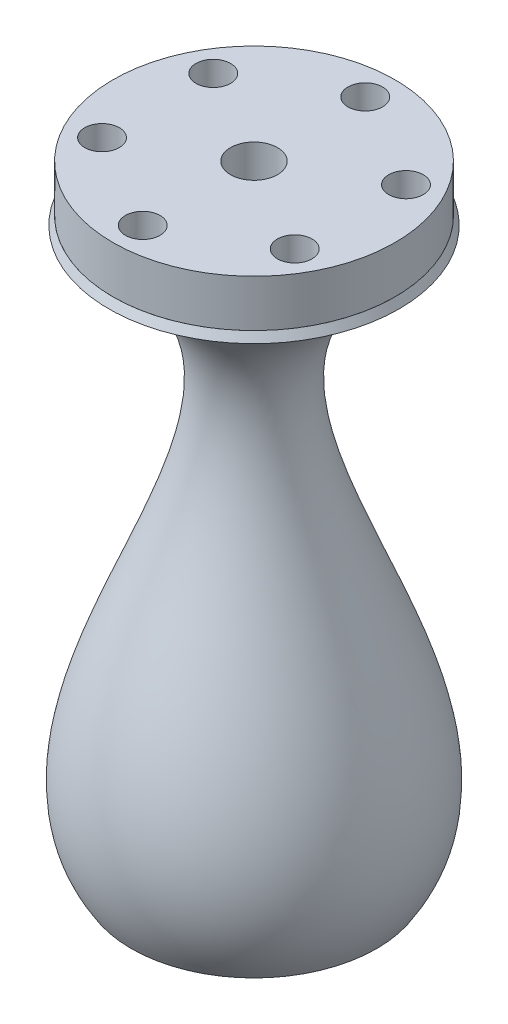
ISO-10303-21;
HEADER;
FILE_DESCRIPTION(('STEP AP214'),'2;1');
FILE_NAME('part.step','',(''),(''),'','','');
FILE_SCHEMA(('AUTOMOTIVE_DESIGN { 1 0 10303 214 1 1 1 1 }'));
ENDSEC;
DATA;
#1=APPLICATION_CONTEXT('core data for automotive mechanical design processes');
#2=APPLICATION_PROTOCOL_DEFINITION('international standard','automotive_design',2000,#1);
#3=PRODUCT_CONTEXT('',#1,'mechanical');
#4=PRODUCT('Part','Part','',(#3));
#5=PRODUCT_RELATED_PRODUCT_CATEGORY('part','',(#4));
#6=PRODUCT_DEFINITION_FORMATION('','',#4);
#7=PRODUCT_DEFINITION_CONTEXT('part definition',#1,'design');
#8=PRODUCT_DEFINITION('design','',#6,#7);
#9=PRODUCT_DEFINITION_SHAPE('','',#8);
#10=(LENGTH_UNIT() NAMED_UNIT(*) SI_UNIT(.MILLI.,.METRE.));
#11=(NAMED_UNIT(*) PLANE_ANGLE_UNIT() SI_UNIT($,.RADIAN.));
#12=(NAMED_UNIT(*) SI_UNIT($,.STERADIAN.) SOLID_ANGLE_UNIT());
#13=UNCERTAINTY_MEASURE_WITH_UNIT(LENGTH_MEASURE(1.E-05),#10,'distance_accuracy_value','');
#14=(GEOMETRIC_REPRESENTATION_CONTEXT(3) GLOBAL_UNCERTAINTY_ASSIGNED_CONTEXT((#13)) GLOBAL_UNIT_ASSIGNED_CONTEXT((#10,
#11,#12)) REPRESENTATION_CONTEXT('',''));
#15=CARTESIAN_POINT('',(0.,0.,0.));
#16=DIRECTION('',(0.,0.,1.));
#17=DIRECTION('',(1.,0.,0.));
#18=AXIS2_PLACEMENT_3D('',#15,#16,#17);
#19=CARTESIAN_POINT('',(-31.75,-154.94,0.));
#20=DIRECTION('',(0.,-1.,0.));
#21=DIRECTION('',(1.,0.,0.));
#22=AXIS2_PLACEMENT_3D('',#19,#20,#21);
#23=PLANE('',#22);
#24=CARTESIAN_POINT('',(0.,-154.94,0.));
#25=DIRECTION('',(0.,1.,0.));
#26=DIRECTION('',(-1.,0.,0.));
#27=AXIS2_PLACEMENT_3D('',#24,#25,#26);
#28=CIRCLE('',#27,33.1702305805805);
#29=CARTESIAN_POINT('',(-33.1702305805805,-154.94,0.));
#30=VERTEX_POINT('',#29);
#31=EDGE_CURVE('E59',#30,#30,#28,.T.);
#32=ORIENTED_EDGE('',*,*,#31,.F.);
#33=EDGE_LOOP('',(#32));
#34=FACE_BOUND('',#33,.T.);
#35=ADVANCED_FACE('F45',(#34),#23,.T.);
#36=CARTESIAN_POINT('',(-31.75,-152.4,0.));
#37=DIRECTION('',(0.,-1.,0.));
#38=DIRECTION('',(1.,0.,0.));
#39=AXIS2_PLACEMENT_3D('',#36,#37,#38);
#40=PLANE('',#39);
#41=CARTESIAN_POINT('',(0.,-152.4,0.));
#42=DIRECTION('',(0.,1.,0.));
#43=DIRECTION('',(-1.,0.,0.));
#44=AXIS2_PLACEMENT_3D('',#41,#42,#43);
#45=CIRCLE('',#44,31.75);
#46=CARTESIAN_POINT('',(-31.75,-152.4,0.));
#47=VERTEX_POINT('',#46);
#48=EDGE_CURVE('E11',#47,#47,#45,.T.);
#49=ORIENTED_EDGE('',*,*,#48,.T.);
#50=EDGE_LOOP('',(#49));
#51=FACE_BOUND('',#50,.T.);
#52=ADVANCED_FACE('F85',(#51),#40,.F.);
#53=CARTESIAN_POINT('',(-38.1,0.,0.));
#54=CARTESIAN_POINT('',(32.6762397187131,-33.7855898671001,0.));
#55=CARTESIAN_POINT('',(-59.5523791944092,-107.166993136059,0.));
#56=CARTESIAN_POINT('',(-31.75,-152.4,0.));
#57=B_SPLINE_CURVE_WITH_KNOTS('',3,(#53,#54,#55,#56),.UNSPECIFIED.,.F.,.F.,(4,4),(0.,1.),.UNSPECIFIED.);
#58=CARTESIAN_POINT('',(0.,0.,0.));
#59=DIRECTION('',(0.,1.,0.));
#60=AXIS1_PLACEMENT('',#58,#59);
#61=SURFACE_OF_REVOLUTION('',#57,#60);
#62=ORIENTED_EDGE('',*,*,#48,.F.);
#63=EDGE_LOOP('',(#62));
#64=FACE_BOUND('',#63,.T.);
#65=CARTESIAN_POINT('',(0.,0.,0.));
#66=DIRECTION('',(0.,1.,0.));
#67=DIRECTION('',(-1.,0.,0.));
#68=AXIS2_PLACEMENT_3D('',#65,#66,#67);
#69=CIRCLE('',#68,38.1);
#70=CARTESIAN_POINT('',(-38.1,0.,0.));
#71=VERTEX_POINT('',#70);
#72=EDGE_CURVE('E51',#71,#71,#69,.T.);
#73=ORIENTED_EDGE('',*,*,#72,.T.);
#74=EDGE_LOOP('',(#73));
#75=FACE_BOUND('',#74,.T.);
#76=ADVANCED_FACE('F82',(#64,#75),#61,.T.);
#77=CARTESIAN_POINT('',(0.,-2.29222602947274,0.));
#78=DIRECTION('',(0.,-1.,0.));
#79=DIRECTION('',(1.,0.,0.));
#80=AXIS2_PLACEMENT_3D('',#77,#78,#79);
#81=CONICAL_SURFACE('',#80,39.1942119674942,0.445370328452159);
#82=ORIENTED_EDGE('',*,*,#72,.F.);
#83=EDGE_LOOP('',(#82));
#84=FACE_BOUND('',#83,.T.);
#85=CARTESIAN_POINT('',(0.,-2.29222602947274,0.));
#86=DIRECTION('',(0.,1.,0.));
#87=DIRECTION('',(-1.,0.,0.));
#88=AXIS2_PLACEMENT_3D('',#85,#86,#87);
#89=CIRCLE('',#88,39.1942119674942);
#90=CARTESIAN_POINT('',(-39.1942119674942,-2.29222602947274,0.));
#91=VERTEX_POINT('',#90);
#92=EDGE_CURVE('E55',#91,#91,#89,.T.);
#93=ORIENTED_EDGE('',*,*,#92,.T.);
#94=EDGE_LOOP('',(#93));
#95=FACE_BOUND('',#94,.T.);
#96=ADVANCED_FACE('F78',(#84,#95),#81,.T.);
#97=CARTESIAN_POINT('',(-39.1942119674942,-2.29222602947274,0.));
#98=CARTESIAN_POINT('',(-34.8614389105815,-4.36050903051737,0.));
#99=CARTESIAN_POINT('',(-31.1927398060546,-6.56541806497867,0.));
#100=CARTESIAN_POINT('',(-25.0245259468001,-11.1917654300556,0.));
#101=CARTESIAN_POINT('',(-22.5248031803444,-13.6117942958894,0.));
#102=CARTESIAN_POINT('',(-18.5061974273643,-18.6340152584461,0.));
#103=CARTESIAN_POINT('',(-16.985107261721,-21.2364897960595,0.));
#104=CARTESIAN_POINT('',(-14.7412279242141,-26.6431128882137,0.));
#105=CARTESIAN_POINT('',(-14.0184683618747,-29.4497739423554,0.));
#106=CARTESIAN_POINT('',(-13.2446976955873,-35.2881632791064,0.));
#107=CARTESIAN_POINT('',(-13.1953262185129,-38.3198644747277,0.));
#108=CARTESIAN_POINT('',(-13.662043390385,-44.5854767210561,0.));
#109=CARTESIAN_POINT('',(-14.1784352466751,-47.818456499126,0.));
#110=CARTESIAN_POINT('',(-16.3935618163439,-57.7522203017617,0.));
#111=CARTESIAN_POINT('',(-18.7602520873641,-64.6843609559365,0.));
#112=CARTESIAN_POINT('',(-24.1796149998284,-78.8223622197904,0.));
#113=CARTESIAN_POINT('',(-27.2299749549672,-86.0283321852692,0.));
#114=CARTESIAN_POINT('',(-32.8773088829367,-100.437664235248,0.));
#115=CARTESIAN_POINT('',(-35.4759335781833,-107.640919919764,0.));
#116=CARTESIAN_POINT('',(-38.1609616535489,-118.286689066183,0.));
#117=CARTESIAN_POINT('',(-38.8534735497201,-121.80951657246,0.));
#118=CARTESIAN_POINT('',(-39.6758277379926,-128.780297418311,0.));
#119=CARTESIAN_POINT('',(-39.805605332258,-132.229002500746,0.));
#120=CARTESIAN_POINT('',(-39.331567575255,-139.015933352786,0.));
#121=CARTESIAN_POINT('',(-38.7265059441794,-142.354675982864,0.));
#122=CARTESIAN_POINT('',(-37.1427109304725,-147.225371889751,0.));
#123=CARTESIAN_POINT('',(-36.5022686312662,-148.825657092171,0.));
#124=CARTESIAN_POINT('',(-35.3602879587102,-151.18233174534,0.));
#125=CARTESIAN_POINT('',(-34.9494356916948,-151.960593782365,0.));
#126=CARTESIAN_POINT('',(-34.3970178777034,-152.923416220121,0.));
#127=CARTESIAN_POINT('',(-34.2283792891868,-153.211512947473,0.));
#128=CARTESIAN_POINT('',(-34.0409217152594,-153.522373424794,0.));
#129=CARTESIAN_POINT('',(-33.9680564151279,-153.641733741039,0.));
#130=CARTESIAN_POINT('',(-33.9388489468107,-153.689461715374,0.));
#131=CARTESIAN_POINT('',(-33.9235339112807,-153.714415150231,0.));
#132=CARTESIAN_POINT('',(-33.882444638697,-153.781265232946,0.));
#133=CARTESIAN_POINT('',(-33.6359090031952,-154.182365729234,0.));
#134=CARTESIAN_POINT('',(-33.3893733676933,-154.583466225522,0.));
#135=CARTESIAN_POINT('',(-33.1702305805804,-154.94,0.));
#136=B_SPLINE_CURVE_WITH_KNOTS('',3,(#97,#98,#99,#100,#101,#102,#103,#104,#105,#106,#107,#108,
#109,#110,#111,#112,#113,#114,#115,#116,#117,#118,#119,#120,#121,#122,#123,#124,#125,#126,#127,
#128,#129,#130,#131,#132,#133,#134,#135),.UNSPECIFIED.,.F.,.F.,(4,2,2,2,2,2,2,2,2,2,2,2,2,2,2,1,
1,2,2,1,4),(0.,0.0625,0.125,0.1875,0.25,0.3125,0.375,0.5,0.624999999999999,0.749999999999999,
0.812499999999999,0.874999999999999,0.937499999999999,0.968749999999998,0.984374999999998,
0.988281249999998,0.990234374999998,0.990722656249998,0.991210937499998,0.992187499999998,1.),.UNSPECIFIED.);
#137=CARTESIAN_POINT('',(0.,0.,0.));
#138=DIRECTION('',(0.,1.,0.));
#139=AXIS1_PLACEMENT('',#137,#138);
#140=SURFACE_OF_REVOLUTION('',#136,#139);
#141=ORIENTED_EDGE('',*,*,#31,.T.);
#142=EDGE_LOOP('',(#141));
#143=FACE_BOUND('',#142,.T.);
#144=ORIENTED_EDGE('',*,*,#92,.F.);
#145=EDGE_LOOP('',(#144));
#146=FACE_BOUND('',#145,.T.);
#147=ADVANCED_FACE('F75',(#143,#146),#140,.F.);
#148=CLOSED_SHELL('',(#35,#52,#76,#96,#147));
#149=MANIFOLD_SOLID_BREP('B2',#148);
#150=CARTESIAN_POINT('',(0.,12.7,0.));
#151=DIRECTION('',(0.,1.,0.));
#152=DIRECTION('',(0.,0.,1.));
#153=AXIS2_PLACEMENT_3D('',#150,#151,#152);
#154=PLANE('',#153);
#155=CARTESIAN_POINT('',(0.,12.7,0.));
#156=DIRECTION('',(0.,1.,0.));
#157=DIRECTION('',(0.,0.,1.));
#158=AXIS2_PLACEMENT_3D('',#155,#156,#157);
#159=CIRCLE('',#158,6.35);
#160=CARTESIAN_POINT('',(0.,12.7,6.35));
#161=VERTEX_POINT('',#160);
#162=EDGE_CURVE('E179',#161,#161,#159,.T.);
#163=ORIENTED_EDGE('',*,*,#162,.F.);
#164=EDGE_LOOP('',(#163));
#165=FACE_BOUND('',#164,.T.);
#166=CARTESIAN_POINT('',(-26.0276467925353,12.7,15.0270688820428));
#167=DIRECTION('',(0.,1.,0.));
#168=DIRECTION('',(0.,0.,1.));
#169=AXIS2_PLACEMENT_3D('',#166,#167,#168);
#170=CIRCLE('',#169,4.67329791902137);
#171=CARTESIAN_POINT('',(-26.0276467925353,12.7,19.7003668010641));
#172=VERTEX_POINT('',#171);
#173=EDGE_CURVE('E164',#172,#172,#170,.T.);
#174=ORIENTED_EDGE('',*,*,#173,.F.);
#175=EDGE_LOOP('',(#174));
#176=FACE_BOUND('',#175,.T.);
#177=CARTESIAN_POINT('',(26.0276467925353,12.7,15.0270688820427));
#178=DIRECTION('',(0.,1.,0.));
#179=DIRECTION('',(0.,0.,1.));
#180=AXIS2_PLACEMENT_3D('',#177,#178,#179);
#181=CIRCLE('',#180,4.67329791902138);
#182=CARTESIAN_POINT('',(26.0276467925353,12.7,19.7003668010641));
#183=VERTEX_POINT('',#182);
#184=EDGE_CURVE('E152',#183,#183,#181,.T.);
#185=ORIENTED_EDGE('',*,*,#184,.F.);
#186=EDGE_LOOP('',(#185));
#187=FACE_BOUND('',#186,.T.);
#188=CARTESIAN_POINT('',(0.,12.7,-30.0541377640855));
#189=DIRECTION('',(0.,1.,0.));
#190=DIRECTION('',(0.,0.,1.));
#191=AXIS2_PLACEMENT_3D('',#188,#189,#190);
#192=CIRCLE('',#191,4.67329791902137);
#193=CARTESIAN_POINT('',(0.,12.7,-25.3808398450641));
#194=VERTEX_POINT('',#193);
#195=EDGE_CURVE('E141',#194,#194,#192,.T.);
#196=ORIENTED_EDGE('',*,*,#195,.F.);
#197=EDGE_LOOP('',(#196));
#198=FACE_BOUND('',#197,.T.);
#199=CARTESIAN_POINT('',(0.,12.7,0.));
#200=DIRECTION('',(0.,1.,0.));
#201=DIRECTION('',(0.,0.,1.));
#202=AXIS2_PLACEMENT_3D('',#199,#200,#201);
#203=CIRCLE('',#202,38.1);
#204=CARTESIAN_POINT('',(0.,12.7,38.1));
#205=VERTEX_POINT('',#204);
#206=EDGE_CURVE('E44',#205,#205,#203,.T.);
#207=ORIENTED_EDGE('',*,*,#206,.T.);
#208=EDGE_LOOP('',(#207));
#209=FACE_BOUND('',#208,.T.);
#210=CARTESIAN_POINT('',(26.0276467925353,12.7,-15.0270688820427));
#211=DIRECTION('',(0.,1.,0.));
#212=DIRECTION('',(0.,0.,1.));
#213=AXIS2_PLACEMENT_3D('',#210,#211,#212);
#214=CIRCLE('',#213,4.67329791902137);
#215=CARTESIAN_POINT('',(26.0276467925353,12.7,-10.3537709630214));
#216=VERTEX_POINT('',#215);
#217=EDGE_CURVE('E146',#216,#216,#214,.T.);
#218=ORIENTED_EDGE('',*,*,#217,.F.);
#219=EDGE_LOOP('',(#218));
#220=FACE_BOUND('',#219,.T.);
#221=CARTESIAN_POINT('',(0.,12.7,30.0541377640855));
#222=DIRECTION('',(0.,1.,0.));
#223=DIRECTION('',(0.,0.,1.));
#224=AXIS2_PLACEMENT_3D('',#221,#222,#223);
#225=CIRCLE('',#224,4.67329791902137);
#226=CARTESIAN_POINT('',(0.,12.7,34.7274356831069));
#227=VERTEX_POINT('',#226);
#228=EDGE_CURVE('E158',#227,#227,#225,.T.);
#229=ORIENTED_EDGE('',*,*,#228,.F.);
#230=EDGE_LOOP('',(#229));
#231=FACE_BOUND('',#230,.T.);
#232=CARTESIAN_POINT('',(-26.0276467925353,12.7,-15.0270688820427));
#233=DIRECTION('',(0.,1.,0.));
#234=DIRECTION('',(0.,0.,1.));
#235=AXIS2_PLACEMENT_3D('',#232,#233,#234);
#236=CIRCLE('',#235,4.67329791902137);
#237=CARTESIAN_POINT('',(-26.0276467925353,12.7,-10.3537709630214));
#238=VERTEX_POINT('',#237);
#239=EDGE_CURVE('E170',#238,#238,#236,.T.);
#240=ORIENTED_EDGE('',*,*,#239,.F.);
#241=EDGE_LOOP('',(#240));
#242=FACE_BOUND('',#241,.T.);
#243=ADVANCED_FACE('F130',(#165,#176,#187,#198,#209,#220,#231,#242),#154,.T.);
#244=CARTESIAN_POINT('',(0.,0.,0.));
#245=DIRECTION('',(0.,1.,0.));
#246=DIRECTION('',(0.,0.,1.));
#247=AXIS2_PLACEMENT_3D('',#244,#245,#246);
#248=PLANE('',#247);
#249=CARTESIAN_POINT('',(0.,0.,0.));
#250=DIRECTION('',(0.,1.,0.));
#251=DIRECTION('',(0.,0.,1.));
#252=AXIS2_PLACEMENT_3D('',#249,#250,#251);
#253=CIRCLE('',#252,6.35);
#254=CARTESIAN_POINT('',(0.,0.,6.35));
#255=VERTEX_POINT('',#254);
#256=EDGE_CURVE('E176',#255,#255,#253,.T.);
#257=ORIENTED_EDGE('',*,*,#256,.T.);
#258=EDGE_LOOP('',(#257));
#259=FACE_BOUND('',#258,.T.);
#260=CARTESIAN_POINT('',(0.,0.,0.));
#261=DIRECTION('',(0.,1.,0.));
#262=DIRECTION('',(0.,0.,1.));
#263=AXIS2_PLACEMENT_3D('',#260,#261,#262);
#264=CIRCLE('',#263,38.1);
#265=CARTESIAN_POINT('',(0.,0.,38.1));
#266=VERTEX_POINT('',#265);
#267=EDGE_CURVE('E134',#266,#266,#264,.T.);
#268=ORIENTED_EDGE('',*,*,#267,.F.);
#269=EDGE_LOOP('',(#268));
#270=FACE_BOUND('',#269,.T.);
#271=CARTESIAN_POINT('',(0.,0.,-30.0541377640855));
#272=DIRECTION('',(0.,1.,0.));
#273=DIRECTION('',(0.,0.,1.));
#274=AXIS2_PLACEMENT_3D('',#271,#272,#273);
#275=CIRCLE('',#274,4.67329791902137);
#276=CARTESIAN_POINT('',(0.,0.,-25.3808398450641));
#277=VERTEX_POINT('',#276);
#278=EDGE_CURVE('E143',#277,#277,#275,.T.);
#279=ORIENTED_EDGE('',*,*,#278,.T.);
#280=EDGE_LOOP('',(#279));
#281=FACE_BOUND('',#280,.T.);
#282=CARTESIAN_POINT('',(26.0276467925353,0.,-15.0270688820427));
#283=DIRECTION('',(0.,1.,0.));
#284=DIRECTION('',(0.,0.,1.));
#285=AXIS2_PLACEMENT_3D('',#282,#283,#284);
#286=CIRCLE('',#285,4.67329791902137);
#287=CARTESIAN_POINT('',(26.0276467925353,0.,-10.3537709630214));
#288=VERTEX_POINT('',#287);
#289=EDGE_CURVE('E149',#288,#288,#286,.T.);
#290=ORIENTED_EDGE('',*,*,#289,.T.);
#291=EDGE_LOOP('',(#290));
#292=FACE_BOUND('',#291,.T.);
#293=CARTESIAN_POINT('',(26.0276467925353,0.,15.0270688820427));
#294=DIRECTION('',(0.,1.,0.));
#295=DIRECTION('',(0.,0.,1.));
#296=AXIS2_PLACEMENT_3D('',#293,#294,#295);
#297=CIRCLE('',#296,4.67329791902138);
#298=CARTESIAN_POINT('',(26.0276467925353,0.,19.7003668010641));
#299=VERTEX_POINT('',#298);
#300=EDGE_CURVE('E155',#299,#299,#297,.T.);
#301=ORIENTED_EDGE('',*,*,#300,.T.);
#302=EDGE_LOOP('',(#301));
#303=FACE_BOUND('',#302,.T.);
#304=CARTESIAN_POINT('',(0.,0.,30.0541377640855));
#305=DIRECTION('',(0.,1.,0.));
#306=DIRECTION('',(0.,0.,1.));
#307=AXIS2_PLACEMENT_3D('',#304,#305,#306);
#308=CIRCLE('',#307,4.67329791902137);
#309=CARTESIAN_POINT('',(0.,0.,34.7274356831069));
#310=VERTEX_POINT('',#309);
#311=EDGE_CURVE('E161',#310,#310,#308,.T.);
#312=ORIENTED_EDGE('',*,*,#311,.T.);
#313=EDGE_LOOP('',(#312));
#314=FACE_BOUND('',#313,.T.);
#315=CARTESIAN_POINT('',(-26.0276467925353,0.,15.0270688820428));
#316=DIRECTION('',(0.,1.,0.));
#317=DIRECTION('',(0.,0.,1.));
#318=AXIS2_PLACEMENT_3D('',#315,#316,#317);
#319=CIRCLE('',#318,4.67329791902137);
#320=CARTESIAN_POINT('',(-26.0276467925353,0.,19.7003668010641));
#321=VERTEX_POINT('',#320);
#322=EDGE_CURVE('E167',#321,#321,#319,.T.);
#323=ORIENTED_EDGE('',*,*,#322,.T.);
#324=EDGE_LOOP('',(#323));
#325=FACE_BOUND('',#324,.T.);
#326=CARTESIAN_POINT('',(-26.0276467925353,0.,-15.0270688820427));
#327=DIRECTION('',(0.,1.,0.));
#328=DIRECTION('',(0.,0.,1.));
#329=AXIS2_PLACEMENT_3D('',#326,#327,#328);
#330=CIRCLE('',#329,4.67329791902137);
#331=CARTESIAN_POINT('',(-26.0276467925353,0.,-10.3537709630214));
#332=VERTEX_POINT('',#331);
#333=EDGE_CURVE('E173',#332,#332,#330,.T.);
#334=ORIENTED_EDGE('',*,*,#333,.T.);
#335=EDGE_LOOP('',(#334));
#336=FACE_BOUND('',#335,.T.);
#337=ADVANCED_FACE('F185',(#259,#270,#281,#292,#303,#314,#325,#336),#248,.F.);
#338=CARTESIAN_POINT('',(0.,12.7,0.));
#339=DIRECTION('',(0.,-1.,0.));
#340=DIRECTION('',(0.,0.,-1.));
#341=AXIS2_PLACEMENT_3D('',#338,#339,#340);
#342=CYLINDRICAL_SURFACE('',#341,38.1);
#343=ORIENTED_EDGE('',*,*,#206,.F.);
#344=EDGE_LOOP('',(#343));
#345=FACE_BOUND('',#344,.T.);
#346=ORIENTED_EDGE('',*,*,#267,.T.);
#347=EDGE_LOOP('',(#346));
#348=FACE_BOUND('',#347,.T.);
#349=ADVANCED_FACE('F132',(#345,#348),#342,.T.);
#350=CARTESIAN_POINT('',(0.,12.7,-30.0541377640855));
#351=DIRECTION('',(0.,-1.,0.));
#352=DIRECTION('',(0.,0.,-1.));
#353=AXIS2_PLACEMENT_3D('',#350,#351,#352);
#354=CYLINDRICAL_SURFACE('',#353,4.67329791902137);
#355=ORIENTED_EDGE('',*,*,#195,.T.);
#356=EDGE_LOOP('',(#355));
#357=FACE_BOUND('',#356,.T.);
#358=ORIENTED_EDGE('',*,*,#278,.F.);
#359=EDGE_LOOP('',(#358));
#360=FACE_BOUND('',#359,.T.);
#361=ADVANCED_FACE('F220',(#357,#360),#354,.F.);
#362=CARTESIAN_POINT('',(26.0276467925353,12.7,-15.0270688820427));
#363=DIRECTION('',(0.,-1.,0.));
#364=DIRECTION('',(0.,0.,-1.));
#365=AXIS2_PLACEMENT_3D('',#362,#363,#364);
#366=CYLINDRICAL_SURFACE('',#365,4.67329791902137);
#367=ORIENTED_EDGE('',*,*,#217,.T.);
#368=EDGE_LOOP('',(#367));
#369=FACE_BOUND('',#368,.T.);
#370=ORIENTED_EDGE('',*,*,#289,.F.);
#371=EDGE_LOOP('',(#370));
#372=FACE_BOUND('',#371,.T.);
#373=ADVANCED_FACE('F225',(#369,#372),#366,.F.);
#374=CARTESIAN_POINT('',(26.0276467925353,12.7,15.0270688820427));
#375=DIRECTION('',(0.,-1.,0.));
#376=DIRECTION('',(0.,0.,-1.));
#377=AXIS2_PLACEMENT_3D('',#374,#375,#376);
#378=CYLINDRICAL_SURFACE('',#377,4.67329791902138);
#379=ORIENTED_EDGE('',*,*,#184,.T.);
#380=EDGE_LOOP('',(#379));
#381=FACE_BOUND('',#380,.T.);
#382=ORIENTED_EDGE('',*,*,#300,.F.);
#383=EDGE_LOOP('',(#382));
#384=FACE_BOUND('',#383,.T.);
#385=ADVANCED_FACE('F229',(#381,#384),#378,.F.);
#386=CARTESIAN_POINT('',(0.,12.7,30.0541377640855));
#387=DIRECTION('',(0.,-1.,0.));
#388=DIRECTION('',(0.,0.,-1.));
#389=AXIS2_PLACEMENT_3D('',#386,#387,#388);
#390=CYLINDRICAL_SURFACE('',#389,4.67329791902137);
#391=ORIENTED_EDGE('',*,*,#228,.T.);
#392=EDGE_LOOP('',(#391));
#393=FACE_BOUND('',#392,.T.);
#394=ORIENTED_EDGE('',*,*,#311,.F.);
#395=EDGE_LOOP('',(#394));
#396=FACE_BOUND('',#395,.T.);
#397=ADVANCED_FACE('F233',(#393,#396),#390,.F.);
#398=CARTESIAN_POINT('',(-26.0276467925353,12.7,15.0270688820428));
#399=DIRECTION('',(0.,-1.,0.));
#400=DIRECTION('',(0.,0.,-1.));
#401=AXIS2_PLACEMENT_3D('',#398,#399,#400);
#402=CYLINDRICAL_SURFACE('',#401,4.67329791902137);
#403=ORIENTED_EDGE('',*,*,#173,.T.);
#404=EDGE_LOOP('',(#403));
#405=FACE_BOUND('',#404,.T.);
#406=ORIENTED_EDGE('',*,*,#322,.F.);
#407=EDGE_LOOP('',(#406));
#408=FACE_BOUND('',#407,.T.);
#409=ADVANCED_FACE('F212',(#405,#408),#402,.F.);
#410=CARTESIAN_POINT('',(-26.0276467925353,12.7,-15.0270688820427));
#411=DIRECTION('',(0.,-1.,0.));
#412=DIRECTION('',(0.,0.,-1.));
#413=AXIS2_PLACEMENT_3D('',#410,#411,#412);
#414=CYLINDRICAL_SURFACE('',#413,4.67329791902137);
#415=ORIENTED_EDGE('',*,*,#239,.T.);
#416=EDGE_LOOP('',(#415));
#417=FACE_BOUND('',#416,.T.);
#418=ORIENTED_EDGE('',*,*,#333,.F.);
#419=EDGE_LOOP('',(#418));
#420=FACE_BOUND('',#419,.T.);
#421=ADVANCED_FACE('F191',(#417,#420),#414,.F.);
#422=CARTESIAN_POINT('',(0.,0.,0.));
#423=DIRECTION('',(0.,1.,0.));
#424=DIRECTION('',(0.,0.,1.));
#425=AXIS2_PLACEMENT_3D('',#422,#423,#424);
#426=CYLINDRICAL_SURFACE('',#425,6.35);
#427=ORIENTED_EDGE('',*,*,#256,.F.);
#428=EDGE_LOOP('',(#427));
#429=FACE_BOUND('',#428,.T.);
#430=ORIENTED_EDGE('',*,*,#162,.T.);
#431=EDGE_LOOP('',(#430));
#432=FACE_BOUND('',#431,.T.);
#433=ADVANCED_FACE('F188',(#429,#432),#426,.F.);
#434=CLOSED_SHELL('',(#243,#337,#349,#361,#373,#385,#397,#409,#421,#433));
#435=MANIFOLD_SOLID_BREP('B6',#434);
#436=ADVANCED_BREP_SHAPE_REPRESENTATION('',(#18,#149,#435),#14);
#437=SHAPE_DEFINITION_REPRESENTATION(#9,#436);
ENDSEC;
END-ISO-10303-21;
